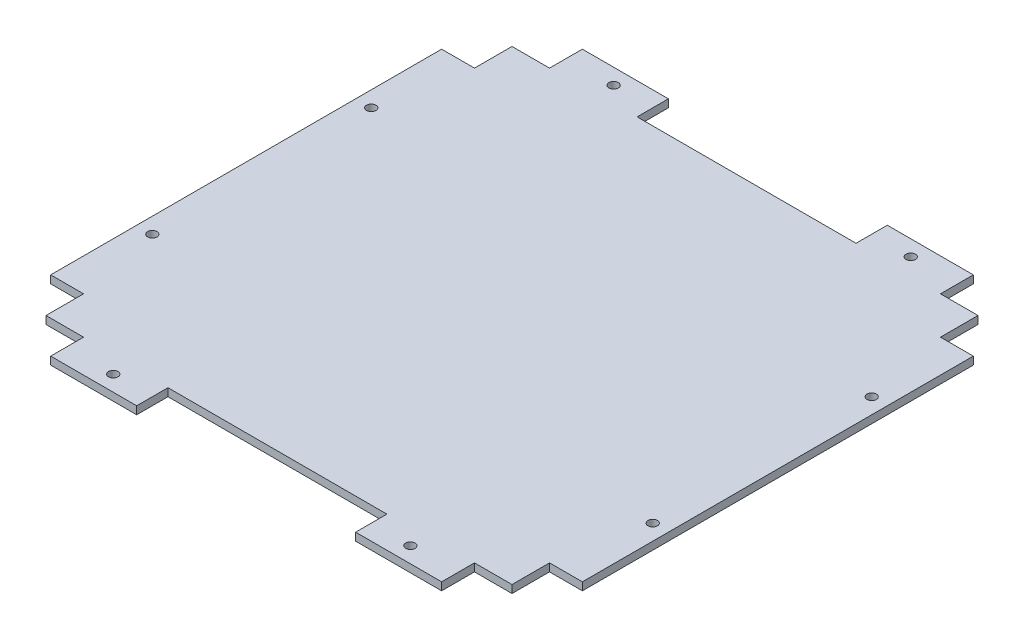
ISO-10303-21;
HEADER;
FILE_DESCRIPTION(('STEP AP214'),'2;1');
FILE_NAME('part.step','',(''),(''),'','','');
FILE_SCHEMA(('AUTOMOTIVE_DESIGN { 1 0 10303 214 1 1 1 1 }'));
ENDSEC;
DATA;
#1=APPLICATION_CONTEXT('core data for automotive mechanical design processes');
#2=APPLICATION_PROTOCOL_DEFINITION('international standard','automotive_design',2000,#1);
#3=PRODUCT_CONTEXT('',#1,'mechanical');
#4=PRODUCT('Part','Part','',(#3));
#5=PRODUCT_RELATED_PRODUCT_CATEGORY('part','',(#4));
#6=PRODUCT_DEFINITION_FORMATION('','',#4);
#7=PRODUCT_DEFINITION_CONTEXT('part definition',#1,'design');
#8=PRODUCT_DEFINITION('design','',#6,#7);
#9=PRODUCT_DEFINITION_SHAPE('','',#8);
#10=(LENGTH_UNIT() NAMED_UNIT(*) SI_UNIT(.MILLI.,.METRE.));
#11=(NAMED_UNIT(*) PLANE_ANGLE_UNIT() SI_UNIT($,.RADIAN.));
#12=(NAMED_UNIT(*) SI_UNIT($,.STERADIAN.) SOLID_ANGLE_UNIT());
#13=UNCERTAINTY_MEASURE_WITH_UNIT(LENGTH_MEASURE(1.E-05),#10,'distance_accuracy_value','');
#14=(GEOMETRIC_REPRESENTATION_CONTEXT(3) GLOBAL_UNCERTAINTY_ASSIGNED_CONTEXT((#13)) GLOBAL_UNIT_ASSIGNED_CONTEXT((#10,
#11,#12)) REPRESENTATION_CONTEXT('',''));
#15=CARTESIAN_POINT('',(0.,0.,0.));
#16=DIRECTION('',(0.,0.,1.));
#17=DIRECTION('',(1.,0.,0.));
#18=AXIS2_PLACEMENT_3D('',#15,#16,#17);
#19=CARTESIAN_POINT('',(45.,5.,340.));
#20=DIRECTION('',(0.,0.,-1.));
#21=DIRECTION('',(-1.,0.,0.));
#22=AXIS2_PLACEMENT_3D('',#19,#20,#21);
#23=PLANE('',#22);
#24=DIRECTION('',(1.,0.,0.));
#25=VECTOR('',#24,1.);
#26=CARTESIAN_POINT('',(45.,0.,340.));
#27=LINE('',#26,#25);
#28=CARTESIAN_POINT('',(45.,0.,340.));
#29=VERTEX_POINT('',#28);
#30=CARTESIAN_POINT('',(100.,0.,340.));
#31=VERTEX_POINT('',#30);
#32=EDGE_CURVE('E404',#29,#31,#27,.T.);
#33=ORIENTED_EDGE('',*,*,#32,.T.);
#34=DIRECTION('',(0.,1.,0.));
#35=VECTOR('',#34,1.);
#36=CARTESIAN_POINT('',(100.,5.,340.));
#37=LINE('',#36,#35);
#38=CARTESIAN_POINT('',(100.,5.,340.));
#39=VERTEX_POINT('',#38);
#40=EDGE_CURVE('E574',#31,#39,#37,.T.);
#41=ORIENTED_EDGE('',*,*,#40,.T.);
#42=DIRECTION('',(1.,0.,0.));
#43=VECTOR('',#42,1.);
#44=CARTESIAN_POINT('',(45.,5.,340.));
#45=LINE('',#44,#43);
#46=CARTESIAN_POINT('',(45.,5.,340.));
#47=VERTEX_POINT('',#46);
#48=EDGE_CURVE('E340',#47,#39,#45,.T.);
#49=ORIENTED_EDGE('',*,*,#48,.F.);
#50=DIRECTION('',(0.,-1.,0.));
#51=VECTOR('',#50,1.);
#52=CARTESIAN_POINT('',(45.,5.,340.));
#53=LINE('',#52,#51);
#54=EDGE_CURVE('E538',#47,#29,#53,.T.);
#55=ORIENTED_EDGE('',*,*,#54,.T.);
#56=EDGE_LOOP('',(#33,#41,#49,#55));
#57=FACE_BOUND('',#56,.T.);
#58=ADVANCED_FACE('F46',(#57),#23,.F.);
#59=CARTESIAN_POINT('',(45.,5.,0.));
#60=DIRECTION('',(0.,0.,1.));
#61=DIRECTION('',(1.,0.,0.));
#62=AXIS2_PLACEMENT_3D('',#59,#60,#61);
#63=PLANE('',#62);
#64=DIRECTION('',(-1.,0.,0.));
#65=VECTOR('',#64,1.);
#66=CARTESIAN_POINT('',(45.,5.,0.));
#67=LINE('',#66,#65);
#68=CARTESIAN_POINT('',(100.,5.,0.));
#69=VERTEX_POINT('',#68);
#70=CARTESIAN_POINT('',(45.,5.,0.));
#71=VERTEX_POINT('',#70);
#72=EDGE_CURVE('E371',#69,#71,#67,.T.);
#73=ORIENTED_EDGE('',*,*,#72,.F.);
#74=DIRECTION('',(0.,-1.,0.));
#75=VECTOR('',#74,1.);
#76=CARTESIAN_POINT('',(100.,5.,0.));
#77=LINE('',#76,#75);
#78=CARTESIAN_POINT('',(100.,0.,0.));
#79=VERTEX_POINT('',#78);
#80=EDGE_CURVE('E248',#69,#79,#77,.T.);
#81=ORIENTED_EDGE('',*,*,#80,.T.);
#82=DIRECTION('',(-1.,0.,0.));
#83=VECTOR('',#82,1.);
#84=CARTESIAN_POINT('',(45.,0.,0.));
#85=LINE('',#84,#83);
#86=CARTESIAN_POINT('',(45.,0.,0.));
#87=VERTEX_POINT('',#86);
#88=EDGE_CURVE('E435',#79,#87,#85,.T.);
#89=ORIENTED_EDGE('',*,*,#88,.T.);
#90=DIRECTION('',(0.,-1.,0.));
#91=VECTOR('',#90,1.);
#92=CARTESIAN_POINT('',(45.,5.,0.));
#93=LINE('',#92,#91);
#94=EDGE_CURVE('E494',#71,#87,#93,.T.);
#95=ORIENTED_EDGE('',*,*,#94,.F.);
#96=EDGE_LOOP('',(#73,#81,#89,#95));
#97=FACE_BOUND('',#96,.T.);
#98=ADVANCED_FACE('F666',(#97),#63,.F.);
#99=CARTESIAN_POINT('',(0.,5.,0.));
#100=DIRECTION('',(0.,1.,0.));
#101=DIRECTION('',(0.,0.,1.));
#102=AXIS2_PLACEMENT_3D('',#99,#100,#101);
#103=PLANE('',#102);
#104=DIRECTION('',(0.,0.,1.));
#105=VECTOR('',#104,1.);
#106=CARTESIAN_POINT('',(100.,5.,0.));
#107=LINE('',#106,#105);
#108=CARTESIAN_POINT('',(100.,5.,20.0000000000002));
#109=VERTEX_POINT('',#108);
#110=EDGE_CURVE('E245',#69,#109,#107,.T.);
#111=ORIENTED_EDGE('',*,*,#110,.F.);
#112=ORIENTED_EDGE('',*,*,#72,.T.);
#113=DIRECTION('',(0.,0.,1.));
#114=VECTOR('',#113,1.);
#115=CARTESIAN_POINT('',(45.,5.,21.));
#116=LINE('',#115,#114);
#117=CARTESIAN_POINT('',(45.,5.,21.));
#118=VERTEX_POINT('',#117);
#119=EDGE_CURVE('E375',#71,#118,#116,.T.);
#120=ORIENTED_EDGE('',*,*,#119,.T.);
#121=DIRECTION('',(-1.,0.,0.));
#122=VECTOR('',#121,1.);
#123=CARTESIAN_POINT('',(21.,5.,21.));
#124=LINE('',#123,#122);
#125=CARTESIAN_POINT('',(21.,5.,21.));
#126=VERTEX_POINT('',#125);
#127=EDGE_CURVE('E378',#118,#126,#124,.T.);
#128=ORIENTED_EDGE('',*,*,#127,.T.);
#129=DIRECTION('',(0.,0.,1.));
#130=VECTOR('',#129,1.);
#131=CARTESIAN_POINT('',(21.,5.,45.));
#132=LINE('',#131,#130);
#133=CARTESIAN_POINT('',(21.,5.,45.));
#134=VERTEX_POINT('',#133);
#135=EDGE_CURVE('E381',#126,#134,#132,.T.);
#136=ORIENTED_EDGE('',*,*,#135,.T.);
#137=DIRECTION('',(-1.,0.,0.));
#138=VECTOR('',#137,1.);
#139=CARTESIAN_POINT('',(0.,5.,45.));
#140=LINE('',#139,#138);
#141=CARTESIAN_POINT('',(0.,5.,45.));
#142=VERTEX_POINT('',#141);
#143=EDGE_CURVE('E384',#134,#142,#140,.T.);
#144=ORIENTED_EDGE('',*,*,#143,.T.);
#145=DIRECTION('',(0.,0.,1.));
#146=VECTOR('',#145,1.);
#147=CARTESIAN_POINT('',(0.,5.,45.));
#148=LINE('',#147,#146);
#149=CARTESIAN_POINT('',(0.,5.,295.));
#150=VERTEX_POINT('',#149);
#151=EDGE_CURVE('E387',#142,#150,#148,.T.);
#152=ORIENTED_EDGE('',*,*,#151,.T.);
#153=DIRECTION('',(1.,0.,0.));
#154=VECTOR('',#153,1.);
#155=CARTESIAN_POINT('',(0.,5.,295.));
#156=LINE('',#155,#154);
#157=CARTESIAN_POINT('',(21.,5.,295.));
#158=VERTEX_POINT('',#157);
#159=EDGE_CURVE('E390',#150,#158,#156,.T.);
#160=ORIENTED_EDGE('',*,*,#159,.T.);
#161=DIRECTION('',(0.,0.,1.));
#162=VECTOR('',#161,1.);
#163=CARTESIAN_POINT('',(21.,5.,295.));
#164=LINE('',#163,#162);
#165=CARTESIAN_POINT('',(21.,5.,319.));
#166=VERTEX_POINT('',#165);
#167=EDGE_CURVE('E393',#158,#166,#164,.T.);
#168=ORIENTED_EDGE('',*,*,#167,.T.);
#169=DIRECTION('',(1.,0.,0.));
#170=VECTOR('',#169,1.);
#171=CARTESIAN_POINT('',(21.,5.,319.));
#172=LINE('',#171,#170);
#173=CARTESIAN_POINT('',(45.,5.,319.));
#174=VERTEX_POINT('',#173);
#175=EDGE_CURVE('E396',#166,#174,#172,.T.);
#176=ORIENTED_EDGE('',*,*,#175,.T.);
#177=DIRECTION('',(0.,0.,1.));
#178=VECTOR('',#177,1.);
#179=CARTESIAN_POINT('',(45.,5.,319.));
#180=LINE('',#179,#178);
#181=EDGE_CURVE('E334',#174,#47,#180,.T.);
#182=ORIENTED_EDGE('',*,*,#181,.T.);
#183=ORIENTED_EDGE('',*,*,#48,.T.);
#184=DIRECTION('',(0.,0.,1.));
#185=VECTOR('',#184,1.);
#186=CARTESIAN_POINT('',(100.,5.,340.));
#187=LINE('',#186,#185);
#188=CARTESIAN_POINT('',(100.,5.,320.));
#189=VERTEX_POINT('',#188);
#190=EDGE_CURVE('E268',#189,#39,#187,.T.);
#191=ORIENTED_EDGE('',*,*,#190,.F.);
#192=DIRECTION('',(-1.,0.,0.));
#193=VECTOR('',#192,1.);
#194=CARTESIAN_POINT('',(100.,5.,320.));
#195=LINE('',#194,#193);
#196=CARTESIAN_POINT('',(240.,5.,320.));
#197=VERTEX_POINT('',#196);
#198=EDGE_CURVE('E274',#197,#189,#195,.T.);
#199=ORIENTED_EDGE('',*,*,#198,.F.);
#200=DIRECTION('',(0.,0.,-1.));
#201=VECTOR('',#200,1.);
#202=CARTESIAN_POINT('',(240.,5.,320.));
#203=LINE('',#202,#201);
#204=CARTESIAN_POINT('',(240.,5.,340.));
#205=VERTEX_POINT('',#204);
#206=EDGE_CURVE('E252',#205,#197,#203,.T.);
#207=ORIENTED_EDGE('',*,*,#206,.F.);
#208=CARTESIAN_POINT('',(295.,5.,340.));
#209=VERTEX_POINT('',#208);
#210=EDGE_CURVE('E338',#205,#209,#45,.T.);
#211=ORIENTED_EDGE('',*,*,#210,.T.);
#212=DIRECTION('',(0.,0.,-1.));
#213=VECTOR('',#212,1.);
#214=CARTESIAN_POINT('',(295.,5.,319.));
#215=LINE('',#214,#213);
#216=CARTESIAN_POINT('',(295.,5.,319.));
#217=VERTEX_POINT('',#216);
#218=EDGE_CURVE('E344',#209,#217,#215,.T.);
#219=ORIENTED_EDGE('',*,*,#218,.T.);
#220=DIRECTION('',(1.,0.,0.));
#221=VECTOR('',#220,1.);
#222=CARTESIAN_POINT('',(319.,5.,319.));
#223=LINE('',#222,#221);
#224=CARTESIAN_POINT('',(319.,5.,319.));
#225=VERTEX_POINT('',#224);
#226=EDGE_CURVE('E347',#217,#225,#223,.T.);
#227=ORIENTED_EDGE('',*,*,#226,.T.);
#228=DIRECTION('',(0.,0.,-1.));
#229=VECTOR('',#228,1.);
#230=CARTESIAN_POINT('',(319.,5.,295.));
#231=LINE('',#230,#229);
#232=CARTESIAN_POINT('',(319.,5.,295.));
#233=VERTEX_POINT('',#232);
#234=EDGE_CURVE('E350',#225,#233,#231,.T.);
#235=ORIENTED_EDGE('',*,*,#234,.T.);
#236=DIRECTION('',(1.,0.,0.));
#237=VECTOR('',#236,1.);
#238=CARTESIAN_POINT('',(340.,5.,295.));
#239=LINE('',#238,#237);
#240=CARTESIAN_POINT('',(340.,5.,295.));
#241=VERTEX_POINT('',#240);
#242=EDGE_CURVE('E353',#233,#241,#239,.T.);
#243=ORIENTED_EDGE('',*,*,#242,.T.);
#244=DIRECTION('',(0.,0.,-1.));
#245=VECTOR('',#244,1.);
#246=CARTESIAN_POINT('',(340.,5.,45.0000000000002));
#247=LINE('',#246,#245);
#248=CARTESIAN_POINT('',(340.,5.,45.0000000000002));
#249=VERTEX_POINT('',#248);
#250=EDGE_CURVE('E356',#241,#249,#247,.T.);
#251=ORIENTED_EDGE('',*,*,#250,.T.);
#252=DIRECTION('',(-1.,0.,0.));
#253=VECTOR('',#252,1.);
#254=CARTESIAN_POINT('',(340.,5.,45.0000000000002));
#255=LINE('',#254,#253);
#256=CARTESIAN_POINT('',(319.,5.,45.0000000000002));
#257=VERTEX_POINT('',#256);
#258=EDGE_CURVE('E359',#249,#257,#255,.T.);
#259=ORIENTED_EDGE('',*,*,#258,.T.);
#260=DIRECTION('',(0.,0.,-1.));
#261=VECTOR('',#260,1.);
#262=CARTESIAN_POINT('',(319.,5.,45.0000000000002));
#263=LINE('',#262,#261);
#264=CARTESIAN_POINT('',(319.,5.,21.0000000000002));
#265=VERTEX_POINT('',#264);
#266=EDGE_CURVE('E362',#257,#265,#263,.T.);
#267=ORIENTED_EDGE('',*,*,#266,.T.);
#268=DIRECTION('',(-1.,0.,0.));
#269=VECTOR('',#268,1.);
#270=CARTESIAN_POINT('',(319.,5.,21.0000000000002));
#271=LINE('',#270,#269);
#272=CARTESIAN_POINT('',(295.,5.,21.0000000000002));
#273=VERTEX_POINT('',#272);
#274=EDGE_CURVE('E365',#265,#273,#271,.T.);
#275=ORIENTED_EDGE('',*,*,#274,.T.);
#276=DIRECTION('',(0.,0.,-1.));
#277=VECTOR('',#276,1.);
#278=CARTESIAN_POINT('',(295.,5.,21.0000000000002));
#279=LINE('',#278,#277);
#280=CARTESIAN_POINT('',(295.,5.,2.22044604925031E-13));
#281=VERTEX_POINT('',#280);
#282=EDGE_CURVE('E368',#273,#281,#279,.T.);
#283=ORIENTED_EDGE('',*,*,#282,.T.);
#284=CARTESIAN_POINT('',(240.,5.,1.73194791841524E-13));
#285=VERTEX_POINT('',#284);
#286=EDGE_CURVE('E372',#281,#285,#67,.T.);
#287=ORIENTED_EDGE('',*,*,#286,.T.);
#288=DIRECTION('',(0.,0.,-1.));
#289=VECTOR('',#288,1.);
#290=CARTESIAN_POINT('',(240.,5.,20.0000000000002));
#291=LINE('',#290,#289);
#292=CARTESIAN_POINT('',(240.,5.,20.0000000000002));
#293=VERTEX_POINT('',#292);
#294=EDGE_CURVE('E70',#293,#285,#291,.T.);
#295=ORIENTED_EDGE('',*,*,#294,.F.);
#296=DIRECTION('',(1.,0.,0.));
#297=VECTOR('',#296,1.);
#298=CARTESIAN_POINT('',(100.,5.,20.0000000000002));
#299=LINE('',#298,#297);
#300=EDGE_CURVE('E238',#109,#293,#299,.T.);
#301=ORIENTED_EDGE('',*,*,#300,.F.);
#302=EDGE_LOOP('',(#111,#112,#120,#128,#136,#144,#152,#160,#168,#176,#182,#183,#191,#199,#207,
#211,#219,#227,#235,#243,#251,#259,#267,#275,#283,#287,#295,#301));
#303=FACE_BOUND('',#302,.T.);
#304=CARTESIAN_POINT('',(265.,5.,10.));
#305=DIRECTION('',(0.,1.,0.));
#306=DIRECTION('',(0.,0.,1.));
#307=AXIS2_PLACEMENT_3D('',#304,#305,#306);
#308=CIRCLE('',#307,2.99999999999999);
#309=CARTESIAN_POINT('',(265.,5.,13.));
#310=VERTEX_POINT('',#309);
#311=EDGE_CURVE('E314',#310,#310,#308,.F.);
#312=ORIENTED_EDGE('',*,*,#311,.T.);
#313=EDGE_LOOP('',(#312));
#314=FACE_BOUND('',#313,.T.);
#315=CARTESIAN_POINT('',(330.,5.,240.));
#316=DIRECTION('',(0.,1.,0.));
#317=DIRECTION('',(0.,0.,1.));
#318=AXIS2_PLACEMENT_3D('',#315,#316,#317);
#319=CIRCLE('',#318,2.99999999999997);
#320=CARTESIAN_POINT('',(330.,5.,243.));
#321=VERTEX_POINT('',#320);
#322=EDGE_CURVE('E309',#321,#321,#319,.F.);
#323=ORIENTED_EDGE('',*,*,#322,.T.);
#324=EDGE_LOOP('',(#323));
#325=FACE_BOUND('',#324,.T.);
#326=CARTESIAN_POINT('',(330.,5.,100.));
#327=DIRECTION('',(0.,1.,0.));
#328=DIRECTION('',(0.,0.,1.));
#329=AXIS2_PLACEMENT_3D('',#326,#327,#328);
#330=CIRCLE('',#329,3.00000000000002);
#331=CARTESIAN_POINT('',(330.,5.,103.));
#332=VERTEX_POINT('',#331);
#333=EDGE_CURVE('E304',#332,#332,#330,.F.);
#334=ORIENTED_EDGE('',*,*,#333,.T.);
#335=EDGE_LOOP('',(#334));
#336=FACE_BOUND('',#335,.T.);
#337=CARTESIAN_POINT('',(75.,5.,10.));
#338=DIRECTION('',(0.,1.,0.));
#339=DIRECTION('',(0.,0.,1.));
#340=AXIS2_PLACEMENT_3D('',#337,#338,#339);
#341=CIRCLE('',#340,3.00000000000001);
#342=CARTESIAN_POINT('',(75.,5.,13.));
#343=VERTEX_POINT('',#342);
#344=EDGE_CURVE('E294',#343,#343,#341,.F.);
#345=ORIENTED_EDGE('',*,*,#344,.T.);
#346=EDGE_LOOP('',(#345));
#347=FACE_BOUND('',#346,.T.);
#348=CARTESIAN_POINT('',(265.,5.,330.));
#349=DIRECTION('',(0.,1.,0.));
#350=DIRECTION('',(0.,0.,1.));
#351=AXIS2_PLACEMENT_3D('',#348,#349,#350);
#352=CIRCLE('',#351,2.99999999999999);
#353=CARTESIAN_POINT('',(265.,5.,333.));
#354=VERTEX_POINT('',#353);
#355=EDGE_CURVE('E299',#354,#354,#352,.T.);
#356=ORIENTED_EDGE('',*,*,#355,.F.);
#357=EDGE_LOOP('',(#356));
#358=FACE_BOUND('',#357,.T.);
#359=CARTESIAN_POINT('',(75.,5.,330.));
#360=DIRECTION('',(0.,1.,0.));
#361=DIRECTION('',(0.,0.,1.));
#362=AXIS2_PLACEMENT_3D('',#359,#360,#361);
#363=CIRCLE('',#362,3.00000000000001);
#364=CARTESIAN_POINT('',(75.,5.,333.));
#365=VERTEX_POINT('',#364);
#366=EDGE_CURVE('E319',#365,#365,#363,.T.);
#367=ORIENTED_EDGE('',*,*,#366,.F.);
#368=EDGE_LOOP('',(#367));
#369=FACE_BOUND('',#368,.T.);
#370=CARTESIAN_POINT('',(10.0000000000001,5.,240.));
#371=DIRECTION('',(0.,1.,0.));
#372=DIRECTION('',(0.,0.,1.));
#373=AXIS2_PLACEMENT_3D('',#370,#371,#372);
#374=CIRCLE('',#373,2.99999999999998);
#375=CARTESIAN_POINT('',(10.0000000000001,5.,243.));
#376=VERTEX_POINT('',#375);
#377=EDGE_CURVE('E324',#376,#376,#374,.T.);
#378=ORIENTED_EDGE('',*,*,#377,.F.);
#379=EDGE_LOOP('',(#378));
#380=FACE_BOUND('',#379,.T.);
#381=CARTESIAN_POINT('',(10.,5.,100.));
#382=DIRECTION('',(0.,1.,0.));
#383=DIRECTION('',(0.,0.,1.));
#384=AXIS2_PLACEMENT_3D('',#381,#382,#383);
#385=CIRCLE('',#384,3.00000000000002);
#386=CARTESIAN_POINT('',(10.,5.,103.));
#387=VERTEX_POINT('',#386);
#388=EDGE_CURVE('E329',#387,#387,#385,.T.);
#389=ORIENTED_EDGE('',*,*,#388,.F.);
#390=EDGE_LOOP('',(#389));
#391=FACE_BOUND('',#390,.T.);
#392=ADVANCED_FACE('F254',(#303,#314,#325,#336,#347,#358,#369,#380,#391),#103,.T.);
#393=CARTESIAN_POINT('',(0.,0.,0.));
#394=DIRECTION('',(0.,1.,0.));
#395=DIRECTION('',(0.,0.,1.));
#396=AXIS2_PLACEMENT_3D('',#393,#394,#395);
#397=PLANE('',#396);
#398=ORIENTED_EDGE('',*,*,#88,.F.);
#399=DIRECTION('',(0.,0.,1.));
#400=VECTOR('',#399,1.);
#401=CARTESIAN_POINT('',(100.,0.,0.));
#402=LINE('',#401,#400);
#403=CARTESIAN_POINT('',(100.,0.,20.0000000000002));
#404=VERTEX_POINT('',#403);
#405=EDGE_CURVE('E284',#79,#404,#402,.T.);
#406=ORIENTED_EDGE('',*,*,#405,.T.);
#407=DIRECTION('',(1.,0.,0.));
#408=VECTOR('',#407,1.);
#409=CARTESIAN_POINT('',(0.,0.,20.0000000000002));
#410=LINE('',#409,#408);
#411=CARTESIAN_POINT('',(240.,0.,20.0000000000002));
#412=VERTEX_POINT('',#411);
#413=EDGE_CURVE('E11',#404,#412,#410,.T.);
#414=ORIENTED_EDGE('',*,*,#413,.T.);
#415=DIRECTION('',(0.,0.,-1.));
#416=VECTOR('',#415,1.);
#417=CARTESIAN_POINT('',(240.,0.,0.));
#418=LINE('',#417,#416);
#419=CARTESIAN_POINT('',(240.,0.,2.22044604925031E-13));
#420=VERTEX_POINT('',#419);
#421=EDGE_CURVE('E263',#412,#420,#418,.T.);
#422=ORIENTED_EDGE('',*,*,#421,.T.);
#423=CARTESIAN_POINT('',(295.,0.,2.22044604925031E-13));
#424=VERTEX_POINT('',#423);
#425=EDGE_CURVE('E436',#424,#420,#85,.T.);
#426=ORIENTED_EDGE('',*,*,#425,.F.);
#427=DIRECTION('',(0.,0.,-1.));
#428=VECTOR('',#427,1.);
#429=CARTESIAN_POINT('',(295.,0.,21.0000000000002));
#430=LINE('',#429,#428);
#431=CARTESIAN_POINT('',(295.,0.,21.0000000000002));
#432=VERTEX_POINT('',#431);
#433=EDGE_CURVE('E432',#432,#424,#430,.T.);
#434=ORIENTED_EDGE('',*,*,#433,.F.);
#435=DIRECTION('',(-1.,0.,0.));
#436=VECTOR('',#435,1.);
#437=CARTESIAN_POINT('',(319.,0.,21.0000000000002));
#438=LINE('',#437,#436);
#439=CARTESIAN_POINT('',(319.,0.,21.0000000000002));
#440=VERTEX_POINT('',#439);
#441=EDGE_CURVE('E429',#440,#432,#438,.T.);
#442=ORIENTED_EDGE('',*,*,#441,.F.);
#443=DIRECTION('',(0.,0.,-1.));
#444=VECTOR('',#443,1.);
#445=CARTESIAN_POINT('',(319.,0.,45.0000000000002));
#446=LINE('',#445,#444);
#447=CARTESIAN_POINT('',(319.,0.,45.0000000000002));
#448=VERTEX_POINT('',#447);
#449=EDGE_CURVE('E426',#448,#440,#446,.T.);
#450=ORIENTED_EDGE('',*,*,#449,.F.);
#451=DIRECTION('',(-1.,0.,0.));
#452=VECTOR('',#451,1.);
#453=CARTESIAN_POINT('',(340.,0.,45.0000000000002));
#454=LINE('',#453,#452);
#455=CARTESIAN_POINT('',(340.,0.,45.0000000000002));
#456=VERTEX_POINT('',#455);
#457=EDGE_CURVE('E423',#456,#448,#454,.T.);
#458=ORIENTED_EDGE('',*,*,#457,.F.);
#459=DIRECTION('',(0.,0.,-1.));
#460=VECTOR('',#459,1.);
#461=CARTESIAN_POINT('',(340.,0.,45.0000000000002));
#462=LINE('',#461,#460);
#463=CARTESIAN_POINT('',(340.,0.,295.));
#464=VERTEX_POINT('',#463);
#465=EDGE_CURVE('E420',#464,#456,#462,.T.);
#466=ORIENTED_EDGE('',*,*,#465,.F.);
#467=DIRECTION('',(1.,0.,0.));
#468=VECTOR('',#467,1.);
#469=CARTESIAN_POINT('',(340.,0.,295.));
#470=LINE('',#469,#468);
#471=CARTESIAN_POINT('',(319.,0.,295.));
#472=VERTEX_POINT('',#471);
#473=EDGE_CURVE('E417',#472,#464,#470,.T.);
#474=ORIENTED_EDGE('',*,*,#473,.F.);
#475=DIRECTION('',(0.,0.,-1.));
#476=VECTOR('',#475,1.);
#477=CARTESIAN_POINT('',(319.,0.,295.));
#478=LINE('',#477,#476);
#479=CARTESIAN_POINT('',(319.,0.,319.));
#480=VERTEX_POINT('',#479);
#481=EDGE_CURVE('E414',#480,#472,#478,.T.);
#482=ORIENTED_EDGE('',*,*,#481,.F.);
#483=DIRECTION('',(1.,0.,0.));
#484=VECTOR('',#483,1.);
#485=CARTESIAN_POINT('',(319.,0.,319.));
#486=LINE('',#485,#484);
#487=CARTESIAN_POINT('',(295.,0.,319.));
#488=VERTEX_POINT('',#487);
#489=EDGE_CURVE('E411',#488,#480,#486,.T.);
#490=ORIENTED_EDGE('',*,*,#489,.F.);
#491=DIRECTION('',(0.,0.,-1.));
#492=VECTOR('',#491,1.);
#493=CARTESIAN_POINT('',(295.,0.,319.));
#494=LINE('',#493,#492);
#495=CARTESIAN_POINT('',(295.,0.,340.));
#496=VERTEX_POINT('',#495);
#497=EDGE_CURVE('E408',#496,#488,#494,.T.);
#498=ORIENTED_EDGE('',*,*,#497,.F.);
#499=CARTESIAN_POINT('',(240.,0.,340.));
#500=VERTEX_POINT('',#499);
#501=EDGE_CURVE('E403',#500,#496,#27,.T.);
#502=ORIENTED_EDGE('',*,*,#501,.F.);
#503=DIRECTION('',(0.,0.,-1.));
#504=VECTOR('',#503,1.);
#505=CARTESIAN_POINT('',(240.,0.,0.));
#506=LINE('',#505,#504);
#507=CARTESIAN_POINT('',(240.,0.,320.));
#508=VERTEX_POINT('',#507);
#509=EDGE_CURVE('E62',#500,#508,#506,.T.);
#510=ORIENTED_EDGE('',*,*,#509,.T.);
#511=DIRECTION('',(-1.,0.,0.));
#512=VECTOR('',#511,1.);
#513=CARTESIAN_POINT('',(0.,0.,320.));
#514=LINE('',#513,#512);
#515=CARTESIAN_POINT('',(100.,0.,320.));
#516=VERTEX_POINT('',#515);
#517=EDGE_CURVE('E55',#508,#516,#514,.T.);
#518=ORIENTED_EDGE('',*,*,#517,.T.);
#519=DIRECTION('',(0.,0.,1.));
#520=VECTOR('',#519,1.);
#521=CARTESIAN_POINT('',(100.,0.,0.));
#522=LINE('',#521,#520);
#523=EDGE_CURVE('E289',#516,#31,#522,.T.);
#524=ORIENTED_EDGE('',*,*,#523,.T.);
#525=ORIENTED_EDGE('',*,*,#32,.F.);
#526=DIRECTION('',(0.,0.,1.));
#527=VECTOR('',#526,1.);
#528=CARTESIAN_POINT('',(45.,0.,319.));
#529=LINE('',#528,#527);
#530=CARTESIAN_POINT('',(45.,0.,319.));
#531=VERTEX_POINT('',#530);
#532=EDGE_CURVE('E333',#531,#29,#529,.T.);
#533=ORIENTED_EDGE('',*,*,#532,.F.);
#534=DIRECTION('',(1.,0.,0.));
#535=VECTOR('',#534,1.);
#536=CARTESIAN_POINT('',(21.,0.,319.));
#537=LINE('',#536,#535);
#538=CARTESIAN_POINT('',(21.,0.,319.));
#539=VERTEX_POINT('',#538);
#540=EDGE_CURVE('E339',#539,#531,#537,.T.);
#541=ORIENTED_EDGE('',*,*,#540,.F.);
#542=DIRECTION('',(0.,0.,1.));
#543=VECTOR('',#542,1.);
#544=CARTESIAN_POINT('',(21.,0.,295.));
#545=LINE('',#544,#543);
#546=CARTESIAN_POINT('',(21.,0.,295.));
#547=VERTEX_POINT('',#546);
#548=EDGE_CURVE('E458',#547,#539,#545,.T.);
#549=ORIENTED_EDGE('',*,*,#548,.F.);
#550=DIRECTION('',(1.,0.,0.));
#551=VECTOR('',#550,1.);
#552=CARTESIAN_POINT('',(0.,0.,295.));
#553=LINE('',#552,#551);
#554=CARTESIAN_POINT('',(0.,0.,295.));
#555=VERTEX_POINT('',#554);
#556=EDGE_CURVE('E455',#555,#547,#553,.T.);
#557=ORIENTED_EDGE('',*,*,#556,.F.);
#558=DIRECTION('',(0.,0.,1.));
#559=VECTOR('',#558,1.);
#560=CARTESIAN_POINT('',(0.,0.,45.));
#561=LINE('',#560,#559);
#562=CARTESIAN_POINT('',(0.,0.,45.));
#563=VERTEX_POINT('',#562);
#564=EDGE_CURVE('E452',#563,#555,#561,.T.);
#565=ORIENTED_EDGE('',*,*,#564,.F.);
#566=DIRECTION('',(-1.,0.,0.));
#567=VECTOR('',#566,1.);
#568=CARTESIAN_POINT('',(0.,0.,45.));
#569=LINE('',#568,#567);
#570=CARTESIAN_POINT('',(21.,0.,45.));
#571=VERTEX_POINT('',#570);
#572=EDGE_CURVE('E449',#571,#563,#569,.T.);
#573=ORIENTED_EDGE('',*,*,#572,.F.);
#574=DIRECTION('',(0.,0.,1.));
#575=VECTOR('',#574,1.);
#576=CARTESIAN_POINT('',(21.,0.,45.));
#577=LINE('',#576,#575);
#578=CARTESIAN_POINT('',(21.,0.,21.));
#579=VERTEX_POINT('',#578);
#580=EDGE_CURVE('E446',#579,#571,#577,.T.);
#581=ORIENTED_EDGE('',*,*,#580,.F.);
#582=DIRECTION('',(-1.,0.,0.));
#583=VECTOR('',#582,1.);
#584=CARTESIAN_POINT('',(21.,0.,21.));
#585=LINE('',#584,#583);
#586=CARTESIAN_POINT('',(45.,0.,21.));
#587=VERTEX_POINT('',#586);
#588=EDGE_CURVE('E443',#587,#579,#585,.T.);
#589=ORIENTED_EDGE('',*,*,#588,.F.);
#590=DIRECTION('',(0.,0.,1.));
#591=VECTOR('',#590,1.);
#592=CARTESIAN_POINT('',(45.,0.,21.));
#593=LINE('',#592,#591);
#594=EDGE_CURVE('E440',#87,#587,#593,.T.);
#595=ORIENTED_EDGE('',*,*,#594,.F.);
#596=EDGE_LOOP('',(#398,#406,#414,#422,#426,#434,#442,#450,#458,#466,#474,#482,#490,#498,#502,
#510,#518,#524,#525,#533,#541,#549,#557,#565,#573,#581,#589,#595));
#597=FACE_BOUND('',#596,.T.);
#598=CARTESIAN_POINT('',(10.0000000000001,0.,240.));
#599=DIRECTION('',(0.,1.,0.));
#600=DIRECTION('',(0.,0.,1.));
#601=AXIS2_PLACEMENT_3D('',#598,#599,#600);
#602=CIRCLE('',#601,2.99999999999998);
#603=CARTESIAN_POINT('',(10.0000000000001,0.,243.));
#604=VERTEX_POINT('',#603);
#605=EDGE_CURVE('E323',#604,#604,#602,.T.);
#606=ORIENTED_EDGE('',*,*,#605,.T.);
#607=EDGE_LOOP('',(#606));
#608=FACE_BOUND('',#607,.T.);
#609=CARTESIAN_POINT('',(265.,0.,330.));
#610=DIRECTION('',(0.,1.,0.));
#611=DIRECTION('',(0.,0.,1.));
#612=AXIS2_PLACEMENT_3D('',#609,#610,#611);
#613=CIRCLE('',#612,2.99999999999999);
#614=CARTESIAN_POINT('',(265.,0.,333.));
#615=VERTEX_POINT('',#614);
#616=EDGE_CURVE('E298',#615,#615,#613,.T.);
#617=ORIENTED_EDGE('',*,*,#616,.T.);
#618=EDGE_LOOP('',(#617));
#619=FACE_BOUND('',#618,.T.);
#620=CARTESIAN_POINT('',(75.,0.,10.));
#621=DIRECTION('',(0.,1.,0.));
#622=DIRECTION('',(0.,0.,1.));
#623=AXIS2_PLACEMENT_3D('',#620,#621,#622);
#624=CIRCLE('',#623,3.00000000000001);
#625=CARTESIAN_POINT('',(75.,0.,13.));
#626=VERTEX_POINT('',#625);
#627=EDGE_CURVE('E293',#626,#626,#624,.F.);
#628=ORIENTED_EDGE('',*,*,#627,.F.);
#629=EDGE_LOOP('',(#628));
#630=FACE_BOUND('',#629,.T.);
#631=CARTESIAN_POINT('',(330.,0.,100.));
#632=DIRECTION('',(0.,1.,0.));
#633=DIRECTION('',(0.,0.,1.));
#634=AXIS2_PLACEMENT_3D('',#631,#632,#633);
#635=CIRCLE('',#634,3.00000000000002);
#636=CARTESIAN_POINT('',(330.,0.,103.));
#637=VERTEX_POINT('',#636);
#638=EDGE_CURVE('E303',#637,#637,#635,.F.);
#639=ORIENTED_EDGE('',*,*,#638,.F.);
#640=EDGE_LOOP('',(#639));
#641=FACE_BOUND('',#640,.T.);
#642=CARTESIAN_POINT('',(330.,0.,240.));
#643=DIRECTION('',(0.,1.,0.));
#644=DIRECTION('',(0.,0.,1.));
#645=AXIS2_PLACEMENT_3D('',#642,#643,#644);
#646=CIRCLE('',#645,2.99999999999997);
#647=CARTESIAN_POINT('',(330.,0.,243.));
#648=VERTEX_POINT('',#647);
#649=EDGE_CURVE('E308',#648,#648,#646,.F.);
#650=ORIENTED_EDGE('',*,*,#649,.F.);
#651=EDGE_LOOP('',(#650));
#652=FACE_BOUND('',#651,.T.);
#653=CARTESIAN_POINT('',(265.,0.,10.));
#654=DIRECTION('',(0.,1.,0.));
#655=DIRECTION('',(0.,0.,1.));
#656=AXIS2_PLACEMENT_3D('',#653,#654,#655);
#657=CIRCLE('',#656,2.99999999999999);
#658=CARTESIAN_POINT('',(265.,0.,13.));
#659=VERTEX_POINT('',#658);
#660=EDGE_CURVE('E313',#659,#659,#657,.F.);
#661=ORIENTED_EDGE('',*,*,#660,.F.);
#662=EDGE_LOOP('',(#661));
#663=FACE_BOUND('',#662,.T.);
#664=CARTESIAN_POINT('',(75.,0.,330.));
#665=DIRECTION('',(0.,1.,0.));
#666=DIRECTION('',(0.,0.,1.));
#667=AXIS2_PLACEMENT_3D('',#664,#665,#666);
#668=CIRCLE('',#667,3.00000000000001);
#669=CARTESIAN_POINT('',(75.,0.,333.));
#670=VERTEX_POINT('',#669);
#671=EDGE_CURVE('E318',#670,#670,#668,.T.);
#672=ORIENTED_EDGE('',*,*,#671,.T.);
#673=EDGE_LOOP('',(#672));
#674=FACE_BOUND('',#673,.T.);
#675=CARTESIAN_POINT('',(10.,0.,100.));
#676=DIRECTION('',(0.,1.,0.));
#677=DIRECTION('',(0.,0.,1.));
#678=AXIS2_PLACEMENT_3D('',#675,#676,#677);
#679=CIRCLE('',#678,3.00000000000002);
#680=CARTESIAN_POINT('',(10.,0.,103.));
#681=VERTEX_POINT('',#680);
#682=EDGE_CURVE('E328',#681,#681,#679,.T.);
#683=ORIENTED_EDGE('',*,*,#682,.T.);
#684=EDGE_LOOP('',(#683));
#685=FACE_BOUND('',#684,.T.);
#686=ADVANCED_FACE('F581',(#597,#608,#619,#630,#641,#652,#663,#674,#685),#397,.F.);
#687=CARTESIAN_POINT('',(45.,5.,319.));
#688=DIRECTION('',(1.,0.,0.));
#689=DIRECTION('',(0.,0.,-1.));
#690=AXIS2_PLACEMENT_3D('',#687,#688,#689);
#691=PLANE('',#690);
#692=ORIENTED_EDGE('',*,*,#532,.T.);
#693=ORIENTED_EDGE('',*,*,#54,.F.);
#694=ORIENTED_EDGE('',*,*,#181,.F.);
#695=DIRECTION('',(0.,-1.,0.));
#696=VECTOR('',#695,1.);
#697=CARTESIAN_POINT('',(45.,5.,319.));
#698=LINE('',#697,#696);
#699=EDGE_CURVE('E399',#174,#531,#698,.T.);
#700=ORIENTED_EDGE('',*,*,#699,.T.);
#701=EDGE_LOOP('',(#692,#693,#694,#700));
#702=FACE_BOUND('',#701,.T.);
#703=ADVANCED_FACE('F48',(#702),#691,.F.);
#704=ORIENTED_EDGE('',*,*,#210,.F.);
#705=DIRECTION('',(0.,-1.,0.));
#706=VECTOR('',#705,1.);
#707=CARTESIAN_POINT('',(240.,5.,340.));
#708=LINE('',#707,#706);
#709=EDGE_CURVE('E571',#205,#500,#708,.T.);
#710=ORIENTED_EDGE('',*,*,#709,.T.);
#711=ORIENTED_EDGE('',*,*,#501,.T.);
#712=DIRECTION('',(0.,-1.,0.));
#713=VECTOR('',#712,1.);
#714=CARTESIAN_POINT('',(295.,5.,340.));
#715=LINE('',#714,#713);
#716=EDGE_CURVE('E534',#209,#496,#715,.T.);
#717=ORIENTED_EDGE('',*,*,#716,.F.);
#718=EDGE_LOOP('',(#704,#710,#711,#717));
#719=FACE_BOUND('',#718,.T.);
#720=ADVANCED_FACE('F645',(#719),#23,.F.);
#721=CARTESIAN_POINT('',(295.,5.,319.));
#722=DIRECTION('',(-1.,0.,0.));
#723=DIRECTION('',(0.,0.,1.));
#724=AXIS2_PLACEMENT_3D('',#721,#722,#723);
#725=PLANE('',#724);
#726=ORIENTED_EDGE('',*,*,#497,.T.);
#727=DIRECTION('',(0.,-1.,0.));
#728=VECTOR('',#727,1.);
#729=CARTESIAN_POINT('',(295.,5.,319.));
#730=LINE('',#729,#728);
#731=EDGE_CURVE('E530',#217,#488,#730,.T.);
#732=ORIENTED_EDGE('',*,*,#731,.F.);
#733=ORIENTED_EDGE('',*,*,#218,.F.);
#734=ORIENTED_EDGE('',*,*,#716,.T.);
#735=EDGE_LOOP('',(#726,#732,#733,#734));
#736=FACE_BOUND('',#735,.T.);
#737=ADVANCED_FACE('F649',(#736),#725,.F.);
#738=CARTESIAN_POINT('',(319.,5.,319.));
#739=DIRECTION('',(0.,0.,-1.));
#740=DIRECTION('',(-1.,0.,0.));
#741=AXIS2_PLACEMENT_3D('',#738,#739,#740);
#742=PLANE('',#741);
#743=ORIENTED_EDGE('',*,*,#489,.T.);
#744=DIRECTION('',(0.,-1.,0.));
#745=VECTOR('',#744,1.);
#746=CARTESIAN_POINT('',(319.,5.,319.));
#747=LINE('',#746,#745);
#748=EDGE_CURVE('E526',#225,#480,#747,.T.);
#749=ORIENTED_EDGE('',*,*,#748,.F.);
#750=ORIENTED_EDGE('',*,*,#226,.F.);
#751=ORIENTED_EDGE('',*,*,#731,.T.);
#752=EDGE_LOOP('',(#743,#749,#750,#751));
#753=FACE_BOUND('',#752,.T.);
#754=ADVANCED_FACE('F656',(#753),#742,.F.);
#755=CARTESIAN_POINT('',(319.,5.,295.));
#756=DIRECTION('',(-1.,0.,0.));
#757=DIRECTION('',(0.,0.,1.));
#758=AXIS2_PLACEMENT_3D('',#755,#756,#757);
#759=PLANE('',#758);
#760=ORIENTED_EDGE('',*,*,#481,.T.);
#761=DIRECTION('',(0.,-1.,0.));
#762=VECTOR('',#761,1.);
#763=CARTESIAN_POINT('',(319.,5.,295.));
#764=LINE('',#763,#762);
#765=EDGE_CURVE('E522',#233,#472,#764,.T.);
#766=ORIENTED_EDGE('',*,*,#765,.F.);
#767=ORIENTED_EDGE('',*,*,#234,.F.);
#768=ORIENTED_EDGE('',*,*,#748,.T.);
#769=EDGE_LOOP('',(#760,#766,#767,#768));
#770=FACE_BOUND('',#769,.T.);
#771=ADVANCED_FACE('F660',(#770),#759,.F.);
#772=CARTESIAN_POINT('',(340.,5.,295.));
#773=DIRECTION('',(0.,0.,-1.));
#774=DIRECTION('',(-1.,0.,0.));
#775=AXIS2_PLACEMENT_3D('',#772,#773,#774);
#776=PLANE('',#775);
#777=ORIENTED_EDGE('',*,*,#473,.T.);
#778=DIRECTION('',(0.,-1.,0.));
#779=VECTOR('',#778,1.);
#780=CARTESIAN_POINT('',(340.,5.,295.));
#781=LINE('',#780,#779);
#782=EDGE_CURVE('E518',#241,#464,#781,.T.);
#783=ORIENTED_EDGE('',*,*,#782,.F.);
#784=ORIENTED_EDGE('',*,*,#242,.F.);
#785=ORIENTED_EDGE('',*,*,#765,.T.);
#786=EDGE_LOOP('',(#777,#783,#784,#785));
#787=FACE_BOUND('',#786,.T.);
#788=ADVANCED_FACE('F1058',(#787),#776,.F.);
#789=CARTESIAN_POINT('',(340.,5.,45.0000000000002));
#790=DIRECTION('',(-1.,0.,0.));
#791=DIRECTION('',(0.,0.,1.));
#792=AXIS2_PLACEMENT_3D('',#789,#790,#791);
#793=PLANE('',#792);
#794=ORIENTED_EDGE('',*,*,#465,.T.);
#795=DIRECTION('',(0.,-1.,0.));
#796=VECTOR('',#795,1.);
#797=CARTESIAN_POINT('',(340.,5.,45.0000000000002));
#798=LINE('',#797,#796);
#799=EDGE_CURVE('E514',#249,#456,#798,.T.);
#800=ORIENTED_EDGE('',*,*,#799,.F.);
#801=ORIENTED_EDGE('',*,*,#250,.F.);
#802=ORIENTED_EDGE('',*,*,#782,.T.);
#803=EDGE_LOOP('',(#794,#800,#801,#802));
#804=FACE_BOUND('',#803,.T.);
#805=ADVANCED_FACE('F1046',(#804),#793,.F.);
#806=CARTESIAN_POINT('',(340.,5.,45.0000000000002));
#807=DIRECTION('',(0.,0.,1.));
#808=DIRECTION('',(1.,0.,0.));
#809=AXIS2_PLACEMENT_3D('',#806,#807,#808);
#810=PLANE('',#809);
#811=ORIENTED_EDGE('',*,*,#457,.T.);
#812=DIRECTION('',(0.,-1.,0.));
#813=VECTOR('',#812,1.);
#814=CARTESIAN_POINT('',(319.,5.,45.0000000000002));
#815=LINE('',#814,#813);
#816=EDGE_CURVE('E510',#257,#448,#815,.T.);
#817=ORIENTED_EDGE('',*,*,#816,.F.);
#818=ORIENTED_EDGE('',*,*,#258,.F.);
#819=ORIENTED_EDGE('',*,*,#799,.T.);
#820=EDGE_LOOP('',(#811,#817,#818,#819));
#821=FACE_BOUND('',#820,.T.);
#822=ADVANCED_FACE('F1034',(#821),#810,.F.);
#823=CARTESIAN_POINT('',(319.,5.,45.0000000000002));
#824=DIRECTION('',(-1.,0.,0.));
#825=DIRECTION('',(0.,0.,1.));
#826=AXIS2_PLACEMENT_3D('',#823,#824,#825);
#827=PLANE('',#826);
#828=ORIENTED_EDGE('',*,*,#449,.T.);
#829=DIRECTION('',(0.,-1.,0.));
#830=VECTOR('',#829,1.);
#831=CARTESIAN_POINT('',(319.,5.,21.0000000000002));
#832=LINE('',#831,#830);
#833=EDGE_CURVE('E506',#265,#440,#832,.T.);
#834=ORIENTED_EDGE('',*,*,#833,.F.);
#835=ORIENTED_EDGE('',*,*,#266,.F.);
#836=ORIENTED_EDGE('',*,*,#816,.T.);
#837=EDGE_LOOP('',(#828,#834,#835,#836));
#838=FACE_BOUND('',#837,.T.);
#839=ADVANCED_FACE('F1022',(#838),#827,.F.);
#840=CARTESIAN_POINT('',(319.,5.,21.0000000000002));
#841=DIRECTION('',(0.,0.,1.));
#842=DIRECTION('',(1.,0.,0.));
#843=AXIS2_PLACEMENT_3D('',#840,#841,#842);
#844=PLANE('',#843);
#845=ORIENTED_EDGE('',*,*,#441,.T.);
#846=DIRECTION('',(0.,-1.,0.));
#847=VECTOR('',#846,1.);
#848=CARTESIAN_POINT('',(295.,5.,21.0000000000002));
#849=LINE('',#848,#847);
#850=EDGE_CURVE('E502',#273,#432,#849,.T.);
#851=ORIENTED_EDGE('',*,*,#850,.F.);
#852=ORIENTED_EDGE('',*,*,#274,.F.);
#853=ORIENTED_EDGE('',*,*,#833,.T.);
#854=EDGE_LOOP('',(#845,#851,#852,#853));
#855=FACE_BOUND('',#854,.T.);
#856=ADVANCED_FACE('F684',(#855),#844,.F.);
#857=CARTESIAN_POINT('',(295.,5.,21.0000000000002));
#858=DIRECTION('',(-1.,0.,0.));
#859=DIRECTION('',(0.,0.,1.));
#860=AXIS2_PLACEMENT_3D('',#857,#858,#859);
#861=PLANE('',#860);
#862=ORIENTED_EDGE('',*,*,#433,.T.);
#863=DIRECTION('',(0.,-1.,0.));
#864=VECTOR('',#863,1.);
#865=CARTESIAN_POINT('',(295.,5.,2.22044604925031E-13));
#866=LINE('',#865,#864);
#867=EDGE_CURVE('E498',#281,#424,#866,.T.);
#868=ORIENTED_EDGE('',*,*,#867,.F.);
#869=ORIENTED_EDGE('',*,*,#282,.F.);
#870=ORIENTED_EDGE('',*,*,#850,.T.);
#871=EDGE_LOOP('',(#862,#868,#869,#870));
#872=FACE_BOUND('',#871,.T.);
#873=ADVANCED_FACE('F678',(#872),#861,.F.);
#874=ORIENTED_EDGE('',*,*,#425,.T.);
#875=DIRECTION('',(0.,1.,0.));
#876=VECTOR('',#875,1.);
#877=CARTESIAN_POINT('',(240.,5.,1.73194791841524E-13));
#878=LINE('',#877,#876);
#879=EDGE_CURVE('E542',#420,#285,#878,.T.);
#880=ORIENTED_EDGE('',*,*,#879,.T.);
#881=ORIENTED_EDGE('',*,*,#286,.F.);
#882=ORIENTED_EDGE('',*,*,#867,.T.);
#883=EDGE_LOOP('',(#874,#880,#881,#882));
#884=FACE_BOUND('',#883,.T.);
#885=ADVANCED_FACE('F669',(#884),#63,.F.);
#886=CARTESIAN_POINT('',(45.,5.,21.));
#887=DIRECTION('',(1.,0.,0.));
#888=DIRECTION('',(0.,0.,-1.));
#889=AXIS2_PLACEMENT_3D('',#886,#887,#888);
#890=PLANE('',#889);
#891=ORIENTED_EDGE('',*,*,#594,.T.);
#892=DIRECTION('',(0.,-1.,0.));
#893=VECTOR('',#892,1.);
#894=CARTESIAN_POINT('',(45.,5.,21.));
#895=LINE('',#894,#893);
#896=EDGE_CURVE('E490',#118,#587,#895,.T.);
#897=ORIENTED_EDGE('',*,*,#896,.F.);
#898=ORIENTED_EDGE('',*,*,#119,.F.);
#899=ORIENTED_EDGE('',*,*,#94,.T.);
#900=EDGE_LOOP('',(#891,#897,#898,#899));
#901=FACE_BOUND('',#900,.T.);
#902=ADVANCED_FACE('F638',(#901),#890,.F.);
#903=CARTESIAN_POINT('',(21.,5.,21.));
#904=DIRECTION('',(0.,0.,1.));
#905=DIRECTION('',(1.,0.,0.));
#906=AXIS2_PLACEMENT_3D('',#903,#904,#905);
#907=PLANE('',#906);
#908=ORIENTED_EDGE('',*,*,#588,.T.);
#909=DIRECTION('',(0.,-1.,0.));
#910=VECTOR('',#909,1.);
#911=CARTESIAN_POINT('',(21.,5.,21.));
#912=LINE('',#911,#910);
#913=EDGE_CURVE('E486',#126,#579,#912,.T.);
#914=ORIENTED_EDGE('',*,*,#913,.F.);
#915=ORIENTED_EDGE('',*,*,#127,.F.);
#916=ORIENTED_EDGE('',*,*,#896,.T.);
#917=EDGE_LOOP('',(#908,#914,#915,#916));
#918=FACE_BOUND('',#917,.T.);
#919=ADVANCED_FACE('F634',(#918),#907,.F.);
#920=CARTESIAN_POINT('',(21.,5.,45.));
#921=DIRECTION('',(1.,0.,0.));
#922=DIRECTION('',(0.,0.,-1.));
#923=AXIS2_PLACEMENT_3D('',#920,#921,#922);
#924=PLANE('',#923);
#925=ORIENTED_EDGE('',*,*,#580,.T.);
#926=DIRECTION('',(0.,-1.,0.));
#927=VECTOR('',#926,1.);
#928=CARTESIAN_POINT('',(21.,5.,45.));
#929=LINE('',#928,#927);
#930=EDGE_CURVE('E482',#134,#571,#929,.T.);
#931=ORIENTED_EDGE('',*,*,#930,.F.);
#932=ORIENTED_EDGE('',*,*,#135,.F.);
#933=ORIENTED_EDGE('',*,*,#913,.T.);
#934=EDGE_LOOP('',(#925,#931,#932,#933));
#935=FACE_BOUND('',#934,.T.);
#936=ADVANCED_FACE('F629',(#935),#924,.F.);
#937=CARTESIAN_POINT('',(0.,5.,45.));
#938=DIRECTION('',(0.,0.,1.));
#939=DIRECTION('',(1.,0.,0.));
#940=AXIS2_PLACEMENT_3D('',#937,#938,#939);
#941=PLANE('',#940);
#942=ORIENTED_EDGE('',*,*,#572,.T.);
#943=DIRECTION('',(0.,-1.,0.));
#944=VECTOR('',#943,1.);
#945=CARTESIAN_POINT('',(0.,5.,45.));
#946=LINE('',#945,#944);
#947=EDGE_CURVE('E478',#142,#563,#946,.T.);
#948=ORIENTED_EDGE('',*,*,#947,.F.);
#949=ORIENTED_EDGE('',*,*,#143,.F.);
#950=ORIENTED_EDGE('',*,*,#930,.T.);
#951=EDGE_LOOP('',(#942,#948,#949,#950));
#952=FACE_BOUND('',#951,.T.);
#953=ADVANCED_FACE('F623',(#952),#941,.F.);
#954=CARTESIAN_POINT('',(0.,5.,45.));
#955=DIRECTION('',(1.,0.,0.));
#956=DIRECTION('',(0.,0.,-1.));
#957=AXIS2_PLACEMENT_3D('',#954,#955,#956);
#958=PLANE('',#957);
#959=ORIENTED_EDGE('',*,*,#564,.T.);
#960=DIRECTION('',(0.,-1.,0.));
#961=VECTOR('',#960,1.);
#962=CARTESIAN_POINT('',(0.,5.,295.));
#963=LINE('',#962,#961);
#964=EDGE_CURVE('E474',#150,#555,#963,.T.);
#965=ORIENTED_EDGE('',*,*,#964,.F.);
#966=ORIENTED_EDGE('',*,*,#151,.F.);
#967=ORIENTED_EDGE('',*,*,#947,.T.);
#968=EDGE_LOOP('',(#959,#965,#966,#967));
#969=FACE_BOUND('',#968,.T.);
#970=ADVANCED_FACE('F619',(#969),#958,.F.);
#971=CARTESIAN_POINT('',(0.,5.,295.));
#972=DIRECTION('',(0.,0.,-1.));
#973=DIRECTION('',(-1.,0.,0.));
#974=AXIS2_PLACEMENT_3D('',#971,#972,#973);
#975=PLANE('',#974);
#976=ORIENTED_EDGE('',*,*,#556,.T.);
#977=DIRECTION('',(0.,-1.,0.));
#978=VECTOR('',#977,1.);
#979=CARTESIAN_POINT('',(21.,5.,295.));
#980=LINE('',#979,#978);
#981=EDGE_CURVE('E470',#158,#547,#980,.T.);
#982=ORIENTED_EDGE('',*,*,#981,.F.);
#983=ORIENTED_EDGE('',*,*,#159,.F.);
#984=ORIENTED_EDGE('',*,*,#964,.T.);
#985=EDGE_LOOP('',(#976,#982,#983,#984));
#986=FACE_BOUND('',#985,.T.);
#987=ADVANCED_FACE('F614',(#986),#975,.F.);
#988=CARTESIAN_POINT('',(21.,5.,295.));
#989=DIRECTION('',(1.,0.,0.));
#990=DIRECTION('',(0.,0.,-1.));
#991=AXIS2_PLACEMENT_3D('',#988,#989,#990);
#992=PLANE('',#991);
#993=ORIENTED_EDGE('',*,*,#548,.T.);
#994=DIRECTION('',(0.,-1.,0.));
#995=VECTOR('',#994,1.);
#996=CARTESIAN_POINT('',(21.,5.,319.));
#997=LINE('',#996,#995);
#998=EDGE_CURVE('E466',#166,#539,#997,.T.);
#999=ORIENTED_EDGE('',*,*,#998,.F.);
#1000=ORIENTED_EDGE('',*,*,#167,.F.);
#1001=ORIENTED_EDGE('',*,*,#981,.T.);
#1002=EDGE_LOOP('',(#993,#999,#1000,#1001));
#1003=FACE_BOUND('',#1002,.T.);
#1004=ADVANCED_FACE('F608',(#1003),#992,.F.);
#1005=CARTESIAN_POINT('',(21.,5.,319.));
#1006=DIRECTION('',(0.,0.,-1.));
#1007=DIRECTION('',(-1.,0.,0.));
#1008=AXIS2_PLACEMENT_3D('',#1005,#1006,#1007);
#1009=PLANE('',#1008);
#1010=ORIENTED_EDGE('',*,*,#540,.T.);
#1011=ORIENTED_EDGE('',*,*,#699,.F.);
#1012=ORIENTED_EDGE('',*,*,#175,.F.);
#1013=ORIENTED_EDGE('',*,*,#998,.T.);
#1014=EDGE_LOOP('',(#1010,#1011,#1012,#1013));
#1015=FACE_BOUND('',#1014,.T.);
#1016=ADVANCED_FACE('F604',(#1015),#1009,.F.);
#1017=CARTESIAN_POINT('',(75.,62.,10.));
#1018=DIRECTION('',(0.,-1.,0.));
#1019=DIRECTION('',(0.,0.,-1.));
#1020=AXIS2_PLACEMENT_3D('',#1017,#1018,#1019);
#1021=CYLINDRICAL_SURFACE('',#1020,3.00000000000001);
#1022=ORIENTED_EDGE('',*,*,#344,.F.);
#1023=EDGE_LOOP('',(#1022));
#1024=FACE_BOUND('',#1023,.T.);
#1025=ORIENTED_EDGE('',*,*,#627,.T.);
#1026=EDGE_LOOP('',(#1025));
#1027=FACE_BOUND('',#1026,.T.);
#1028=ADVANCED_FACE('F716',(#1024,#1027),#1021,.F.);
#1029=CARTESIAN_POINT('',(265.,62.,330.));
#1030=DIRECTION('',(0.,-1.,0.));
#1031=DIRECTION('',(0.,0.,-1.));
#1032=AXIS2_PLACEMENT_3D('',#1029,#1030,#1031);
#1033=CYLINDRICAL_SURFACE('',#1032,2.99999999999999);
#1034=ORIENTED_EDGE('',*,*,#355,.T.);
#1035=EDGE_LOOP('',(#1034));
#1036=FACE_BOUND('',#1035,.T.);
#1037=ORIENTED_EDGE('',*,*,#616,.F.);
#1038=EDGE_LOOP('',(#1037));
#1039=FACE_BOUND('',#1038,.T.);
#1040=ADVANCED_FACE('F712',(#1036,#1039),#1033,.F.);
#1041=CARTESIAN_POINT('',(330.,62.,100.));
#1042=DIRECTION('',(0.,-1.,0.));
#1043=DIRECTION('',(0.,0.,-1.));
#1044=AXIS2_PLACEMENT_3D('',#1041,#1042,#1043);
#1045=CYLINDRICAL_SURFACE('',#1044,3.00000000000002);
#1046=ORIENTED_EDGE('',*,*,#333,.F.);
#1047=EDGE_LOOP('',(#1046));
#1048=FACE_BOUND('',#1047,.T.);
#1049=ORIENTED_EDGE('',*,*,#638,.T.);
#1050=EDGE_LOOP('',(#1049));
#1051=FACE_BOUND('',#1050,.T.);
#1052=ADVANCED_FACE('F708',(#1048,#1051),#1045,.F.);
#1053=CARTESIAN_POINT('',(330.,62.,240.));
#1054=DIRECTION('',(0.,-1.,0.));
#1055=DIRECTION('',(0.,0.,-1.));
#1056=AXIS2_PLACEMENT_3D('',#1053,#1054,#1055);
#1057=CYLINDRICAL_SURFACE('',#1056,2.99999999999997);
#1058=ORIENTED_EDGE('',*,*,#322,.F.);
#1059=EDGE_LOOP('',(#1058));
#1060=FACE_BOUND('',#1059,.T.);
#1061=ORIENTED_EDGE('',*,*,#649,.T.);
#1062=EDGE_LOOP('',(#1061));
#1063=FACE_BOUND('',#1062,.T.);
#1064=ADVANCED_FACE('F711',(#1060,#1063),#1057,.F.);
#1065=CARTESIAN_POINT('',(265.,62.,10.));
#1066=DIRECTION('',(0.,-1.,0.));
#1067=DIRECTION('',(0.,0.,-1.));
#1068=AXIS2_PLACEMENT_3D('',#1065,#1066,#1067);
#1069=CYLINDRICAL_SURFACE('',#1068,2.99999999999999);
#1070=ORIENTED_EDGE('',*,*,#311,.F.);
#1071=EDGE_LOOP('',(#1070));
#1072=FACE_BOUND('',#1071,.T.);
#1073=ORIENTED_EDGE('',*,*,#660,.T.);
#1074=EDGE_LOOP('',(#1073));
#1075=FACE_BOUND('',#1074,.T.);
#1076=ADVANCED_FACE('F718',(#1072,#1075),#1069,.F.);
#1077=CARTESIAN_POINT('',(75.,62.,330.));
#1078=DIRECTION('',(0.,-1.,0.));
#1079=DIRECTION('',(0.,0.,-1.));
#1080=AXIS2_PLACEMENT_3D('',#1077,#1078,#1079);
#1081=CYLINDRICAL_SURFACE('',#1080,3.00000000000001);
#1082=ORIENTED_EDGE('',*,*,#366,.T.);
#1083=EDGE_LOOP('',(#1082));
#1084=FACE_BOUND('',#1083,.T.);
#1085=ORIENTED_EDGE('',*,*,#671,.F.);
#1086=EDGE_LOOP('',(#1085));
#1087=FACE_BOUND('',#1086,.T.);
#1088=ADVANCED_FACE('F721',(#1084,#1087),#1081,.F.);
#1089=CARTESIAN_POINT('',(10.0000000000001,62.,240.));
#1090=DIRECTION('',(0.,-1.,0.));
#1091=DIRECTION('',(0.,0.,-1.));
#1092=AXIS2_PLACEMENT_3D('',#1089,#1090,#1091);
#1093=CYLINDRICAL_SURFACE('',#1092,2.99999999999998);
#1094=ORIENTED_EDGE('',*,*,#377,.T.);
#1095=EDGE_LOOP('',(#1094));
#1096=FACE_BOUND('',#1095,.T.);
#1097=ORIENTED_EDGE('',*,*,#605,.F.);
#1098=EDGE_LOOP('',(#1097));
#1099=FACE_BOUND('',#1098,.T.);
#1100=ADVANCED_FACE('F728',(#1096,#1099),#1093,.F.);
#1101=CARTESIAN_POINT('',(10.,62.,100.));
#1102=DIRECTION('',(0.,-1.,0.));
#1103=DIRECTION('',(0.,0.,-1.));
#1104=AXIS2_PLACEMENT_3D('',#1101,#1102,#1103);
#1105=CYLINDRICAL_SURFACE('',#1104,3.00000000000002);
#1106=ORIENTED_EDGE('',*,*,#388,.T.);
#1107=EDGE_LOOP('',(#1106));
#1108=FACE_BOUND('',#1107,.T.);
#1109=ORIENTED_EDGE('',*,*,#682,.F.);
#1110=EDGE_LOOP('',(#1109));
#1111=FACE_BOUND('',#1110,.T.);
#1112=ADVANCED_FACE('F702',(#1108,#1111),#1105,.F.);
#1113=CARTESIAN_POINT('',(100.,-5.,20.0000000000002));
#1114=DIRECTION('',(0.,0.,1.));
#1115=DIRECTION('',(1.,0.,0.));
#1116=AXIS2_PLACEMENT_3D('',#1113,#1114,#1115);
#1117=PLANE('',#1116);
#1118=DIRECTION('',(0.,1.,0.));
#1119=VECTOR('',#1118,1.);
#1120=CARTESIAN_POINT('',(100.,-5.,20.0000000000002));
#1121=LINE('',#1120,#1119);
#1122=EDGE_CURVE('E233',#404,#109,#1121,.T.);
#1123=ORIENTED_EDGE('',*,*,#1122,.T.);
#1124=ORIENTED_EDGE('',*,*,#300,.T.);
#1125=DIRECTION('',(0.,1.,0.));
#1126=VECTOR('',#1125,1.);
#1127=CARTESIAN_POINT('',(240.,-5.,20.0000000000002));
#1128=LINE('',#1127,#1126);
#1129=EDGE_CURVE('E242',#412,#293,#1128,.T.);
#1130=ORIENTED_EDGE('',*,*,#1129,.F.);
#1131=ORIENTED_EDGE('',*,*,#413,.F.);
#1132=EDGE_LOOP('',(#1123,#1124,#1130,#1131));
#1133=FACE_BOUND('',#1132,.T.);
#1134=ADVANCED_FACE('F235',(#1133),#1117,.F.);
#1135=CARTESIAN_POINT('',(100.,-5.,0.));
#1136=DIRECTION('',(-1.,0.,0.));
#1137=DIRECTION('',(0.,0.,1.));
#1138=AXIS2_PLACEMENT_3D('',#1135,#1136,#1137);
#1139=PLANE('',#1138);
#1140=ORIENTED_EDGE('',*,*,#80,.F.);
#1141=ORIENTED_EDGE('',*,*,#110,.T.);
#1142=ORIENTED_EDGE('',*,*,#1122,.F.);
#1143=ORIENTED_EDGE('',*,*,#405,.F.);
#1144=EDGE_LOOP('',(#1140,#1141,#1142,#1143));
#1145=FACE_BOUND('',#1144,.T.);
#1146=ADVANCED_FACE('F246',(#1145),#1139,.F.);
#1147=CARTESIAN_POINT('',(240.,-5.,20.0000000000002));
#1148=DIRECTION('',(1.,0.,0.));
#1149=DIRECTION('',(0.,0.,-1.));
#1150=AXIS2_PLACEMENT_3D('',#1147,#1148,#1149);
#1151=PLANE('',#1150);
#1152=ORIENTED_EDGE('',*,*,#1129,.T.);
#1153=ORIENTED_EDGE('',*,*,#294,.T.);
#1154=ORIENTED_EDGE('',*,*,#879,.F.);
#1155=ORIENTED_EDGE('',*,*,#421,.F.);
#1156=EDGE_LOOP('',(#1152,#1153,#1154,#1155));
#1157=FACE_BOUND('',#1156,.T.);
#1158=ADVANCED_FACE('F691',(#1157),#1151,.F.);
#1159=CARTESIAN_POINT('',(100.,-5.,320.));
#1160=DIRECTION('',(0.,0.,-1.));
#1161=DIRECTION('',(-1.,0.,0.));
#1162=AXIS2_PLACEMENT_3D('',#1159,#1160,#1161);
#1163=PLANE('',#1162);
#1164=DIRECTION('',(0.,1.,0.));
#1165=VECTOR('',#1164,1.);
#1166=CARTESIAN_POINT('',(240.,-5.,320.));
#1167=LINE('',#1166,#1165);
#1168=EDGE_CURVE('E265',#508,#197,#1167,.T.);
#1169=ORIENTED_EDGE('',*,*,#1168,.T.);
#1170=ORIENTED_EDGE('',*,*,#198,.T.);
#1171=DIRECTION('',(0.,1.,0.));
#1172=VECTOR('',#1171,1.);
#1173=CARTESIAN_POINT('',(100.,-5.,320.));
#1174=LINE('',#1173,#1172);
#1175=EDGE_CURVE('E269',#516,#189,#1174,.T.);
#1176=ORIENTED_EDGE('',*,*,#1175,.F.);
#1177=ORIENTED_EDGE('',*,*,#517,.F.);
#1178=EDGE_LOOP('',(#1169,#1170,#1176,#1177));
#1179=FACE_BOUND('',#1178,.T.);
#1180=ADVANCED_FACE('F586',(#1179),#1163,.F.);
#1181=CARTESIAN_POINT('',(100.,-5.,340.));
#1182=DIRECTION('',(-1.,0.,0.));
#1183=DIRECTION('',(0.,0.,1.));
#1184=AXIS2_PLACEMENT_3D('',#1181,#1182,#1183);
#1185=PLANE('',#1184);
#1186=ORIENTED_EDGE('',*,*,#1175,.T.);
#1187=ORIENTED_EDGE('',*,*,#190,.T.);
#1188=ORIENTED_EDGE('',*,*,#40,.F.);
#1189=ORIENTED_EDGE('',*,*,#523,.F.);
#1190=EDGE_LOOP('',(#1186,#1187,#1188,#1189));
#1191=FACE_BOUND('',#1190,.T.);
#1192=ADVANCED_FACE('F593',(#1191),#1185,.F.);
#1193=CARTESIAN_POINT('',(240.,-5.,320.));
#1194=DIRECTION('',(1.,0.,0.));
#1195=DIRECTION('',(0.,0.,-1.));
#1196=AXIS2_PLACEMENT_3D('',#1193,#1194,#1195);
#1197=PLANE('',#1196);
#1198=ORIENTED_EDGE('',*,*,#709,.F.);
#1199=ORIENTED_EDGE('',*,*,#206,.T.);
#1200=ORIENTED_EDGE('',*,*,#1168,.F.);
#1201=ORIENTED_EDGE('',*,*,#509,.F.);
#1202=EDGE_LOOP('',(#1198,#1199,#1200,#1201));
#1203=FACE_BOUND('',#1202,.T.);
#1204=ADVANCED_FACE('F587',(#1203),#1197,.F.);
#1205=CLOSED_SHELL('',(#58,#98,#392,#686,#703,#720,#737,#754,#771,#788,#805,#822,#839,#856,#873,
#885,#902,#919,#936,#953,#970,#987,#1004,#1016,#1028,#1040,#1052,#1064,#1076,#1088,#1100,#1112,
#1134,#1146,#1158,#1180,#1192,#1204));
#1206=MANIFOLD_SOLID_BREP('B2',#1205);
#1207=ADVANCED_BREP_SHAPE_REPRESENTATION('',(#18,#1206),#14);
#1208=SHAPE_DEFINITION_REPRESENTATION(#9,#1207);
ENDSEC;
END-ISO-10303-21;
